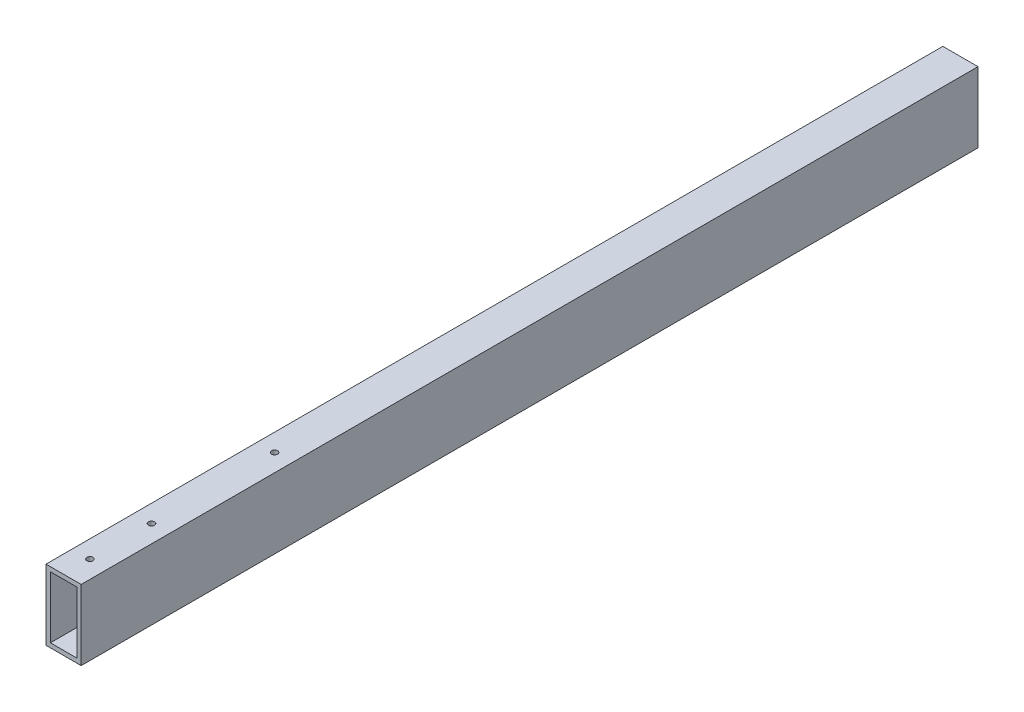
ISO-10303-21;
HEADER;
FILE_DESCRIPTION(('STEP AP214'),'2;1');
FILE_NAME('part.step','',(''),(''),'','','');
FILE_SCHEMA(('AUTOMOTIVE_DESIGN { 1 0 10303 214 1 1 1 1 }'));
ENDSEC;
DATA;
#1=APPLICATION_CONTEXT('core data for automotive mechanical design processes');
#2=APPLICATION_PROTOCOL_DEFINITION('international standard','automotive_design',2000,#1);
#3=PRODUCT_CONTEXT('',#1,'mechanical');
#4=PRODUCT('Part','Part','',(#3));
#5=PRODUCT_RELATED_PRODUCT_CATEGORY('part','',(#4));
#6=PRODUCT_DEFINITION_FORMATION('','',#4);
#7=PRODUCT_DEFINITION_CONTEXT('part definition',#1,'design');
#8=PRODUCT_DEFINITION('design','',#6,#7);
#9=PRODUCT_DEFINITION_SHAPE('','',#8);
#10=(LENGTH_UNIT() NAMED_UNIT(*) SI_UNIT(.MILLI.,.METRE.));
#11=(NAMED_UNIT(*) PLANE_ANGLE_UNIT() SI_UNIT($,.RADIAN.));
#12=(NAMED_UNIT(*) SI_UNIT($,.STERADIAN.) SOLID_ANGLE_UNIT());
#13=UNCERTAINTY_MEASURE_WITH_UNIT(LENGTH_MEASURE(1.E-05),#10,'distance_accuracy_value','');
#14=(GEOMETRIC_REPRESENTATION_CONTEXT(3) GLOBAL_UNCERTAINTY_ASSIGNED_CONTEXT((#13)) GLOBAL_UNIT_ASSIGNED_CONTEXT((#10,
#11,#12)) REPRESENTATION_CONTEXT('',''));
#15=CARTESIAN_POINT('',(0.,0.,0.));
#16=DIRECTION('',(0.,0.,1.));
#17=DIRECTION('',(1.,0.,0.));
#18=AXIS2_PLACEMENT_3D('',#15,#16,#17);
#19=CARTESIAN_POINT('',(0.,0.,323.85));
#20=DIRECTION('',(0.,0.,1.));
#21=DIRECTION('',(1.,0.,0.));
#22=AXIS2_PLACEMENT_3D('',#19,#20,#21);
#23=PLANE('',#22);
#24=DIRECTION('',(0.,1.,0.));
#25=VECTOR('',#24,1.);
#26=CARTESIAN_POINT('',(12.7,25.4,323.85));
#27=LINE('',#26,#25);
#28=CARTESIAN_POINT('',(12.7,-25.4,323.85));
#29=VERTEX_POINT('',#28);
#30=CARTESIAN_POINT('',(12.7,25.4,323.85));
#31=VERTEX_POINT('',#30);
#32=EDGE_CURVE('E140',#29,#31,#27,.T.);
#33=ORIENTED_EDGE('',*,*,#32,.T.);
#34=DIRECTION('',(-1.,0.,0.));
#35=VECTOR('',#34,1.);
#36=CARTESIAN_POINT('',(-12.7,25.4,323.85));
#37=LINE('',#36,#35);
#38=CARTESIAN_POINT('',(-12.7,25.4,323.85));
#39=VERTEX_POINT('',#38);
#40=EDGE_CURVE('E143',#31,#39,#37,.T.);
#41=ORIENTED_EDGE('',*,*,#40,.T.);
#42=DIRECTION('',(0.,-1.,0.));
#43=VECTOR('',#42,1.);
#44=CARTESIAN_POINT('',(-12.7,25.4,323.85));
#45=LINE('',#44,#43);
#46=CARTESIAN_POINT('',(-12.7,-25.4,323.85));
#47=VERTEX_POINT('',#46);
#48=EDGE_CURVE('E146',#39,#47,#45,.T.);
#49=ORIENTED_EDGE('',*,*,#48,.T.);
#50=DIRECTION('',(1.,0.,0.));
#51=VECTOR('',#50,1.);
#52=CARTESIAN_POINT('',(-12.7,-25.4,323.85));
#53=LINE('',#52,#51);
#54=EDGE_CURVE('E148',#47,#29,#53,.T.);
#55=ORIENTED_EDGE('',*,*,#54,.T.);
#56=EDGE_LOOP('',(#33,#41,#49,#55));
#57=FACE_BOUND('',#56,.T.);
#58=DIRECTION('',(1.,0.,0.));
#59=VECTOR('',#58,1.);
#60=CARTESIAN_POINT('',(-9.525,-22.225,323.85));
#61=LINE('',#60,#59);
#62=CARTESIAN_POINT('',(-9.525,-22.225,323.85));
#63=VERTEX_POINT('',#62);
#64=CARTESIAN_POINT('',(9.52500000000001,-22.225,323.85));
#65=VERTEX_POINT('',#64);
#66=EDGE_CURVE('E110',#63,#65,#61,.T.);
#67=ORIENTED_EDGE('',*,*,#66,.F.);
#68=DIRECTION('',(0.,-1.,0.));
#69=VECTOR('',#68,1.);
#70=CARTESIAN_POINT('',(-9.525,22.225,323.85));
#71=LINE('',#70,#69);
#72=CARTESIAN_POINT('',(-9.525,22.225,323.85));
#73=VERTEX_POINT('',#72);
#74=EDGE_CURVE('E102',#73,#63,#71,.T.);
#75=ORIENTED_EDGE('',*,*,#74,.F.);
#76=DIRECTION('',(-1.,0.,0.));
#77=VECTOR('',#76,1.);
#78=CARTESIAN_POINT('',(-9.525,22.225,323.85));
#79=LINE('',#78,#77);
#80=CARTESIAN_POINT('',(9.525,22.225,323.85));
#81=VERTEX_POINT('',#80);
#82=EDGE_CURVE('E124',#81,#73,#79,.T.);
#83=ORIENTED_EDGE('',*,*,#82,.F.);
#84=DIRECTION('',(0.,1.,0.));
#85=VECTOR('',#84,1.);
#86=CARTESIAN_POINT('',(9.525,22.225,323.85));
#87=LINE('',#86,#85);
#88=EDGE_CURVE('E122',#65,#81,#87,.T.);
#89=ORIENTED_EDGE('',*,*,#88,.F.);
#90=EDGE_LOOP('',(#67,#75,#83,#89));
#91=FACE_BOUND('',#90,.T.);
#92=ADVANCED_FACE('F35',(#57,#91),#23,.T.);
#93=CARTESIAN_POINT('',(0.,0.,-323.85));
#94=DIRECTION('',(0.,0.,1.));
#95=DIRECTION('',(1.,0.,0.));
#96=AXIS2_PLACEMENT_3D('',#93,#94,#95);
#97=PLANE('',#96);
#98=DIRECTION('',(0.,1.,0.));
#99=VECTOR('',#98,1.);
#100=CARTESIAN_POINT('',(12.7,25.4,-323.85));
#101=LINE('',#100,#99);
#102=CARTESIAN_POINT('',(12.7,-25.4,-323.85));
#103=VERTEX_POINT('',#102);
#104=CARTESIAN_POINT('',(12.7,25.4,-323.85));
#105=VERTEX_POINT('',#104);
#106=EDGE_CURVE('E118',#103,#105,#101,.T.);
#107=ORIENTED_EDGE('',*,*,#106,.F.);
#108=DIRECTION('',(1.,0.,0.));
#109=VECTOR('',#108,1.);
#110=CARTESIAN_POINT('',(-12.7,-25.4,-323.85));
#111=LINE('',#110,#109);
#112=CARTESIAN_POINT('',(-12.7,-25.4,-323.85));
#113=VERTEX_POINT('',#112);
#114=EDGE_CURVE('E144',#113,#103,#111,.T.);
#115=ORIENTED_EDGE('',*,*,#114,.F.);
#116=DIRECTION('',(0.,-1.,0.));
#117=VECTOR('',#116,1.);
#118=CARTESIAN_POINT('',(-12.7,25.4,-323.85));
#119=LINE('',#118,#117);
#120=CARTESIAN_POINT('',(-12.7,25.4,-323.85));
#121=VERTEX_POINT('',#120);
#122=EDGE_CURVE('E155',#121,#113,#119,.T.);
#123=ORIENTED_EDGE('',*,*,#122,.F.);
#124=DIRECTION('',(-1.,0.,0.));
#125=VECTOR('',#124,1.);
#126=CARTESIAN_POINT('',(-12.7,25.4,-323.85));
#127=LINE('',#126,#125);
#128=EDGE_CURVE('E153',#105,#121,#127,.T.);
#129=ORIENTED_EDGE('',*,*,#128,.F.);
#130=EDGE_LOOP('',(#107,#115,#123,#129));
#131=FACE_BOUND('',#130,.T.);
#132=DIRECTION('',(0.,-1.,0.));
#133=VECTOR('',#132,1.);
#134=CARTESIAN_POINT('',(-9.525,22.225,-323.85));
#135=LINE('',#134,#133);
#136=CARTESIAN_POINT('',(-9.525,22.225,-323.85));
#137=VERTEX_POINT('',#136);
#138=CARTESIAN_POINT('',(-9.525,-22.225,-323.85));
#139=VERTEX_POINT('',#138);
#140=EDGE_CURVE('E60',#137,#139,#135,.T.);
#141=ORIENTED_EDGE('',*,*,#140,.T.);
#142=DIRECTION('',(1.,0.,0.));
#143=VECTOR('',#142,1.);
#144=CARTESIAN_POINT('',(-9.525,-22.225,-323.85));
#145=LINE('',#144,#143);
#146=CARTESIAN_POINT('',(9.52500000000001,-22.225,-323.85));
#147=VERTEX_POINT('',#146);
#148=EDGE_CURVE('E117',#139,#147,#145,.T.);
#149=ORIENTED_EDGE('',*,*,#148,.T.);
#150=DIRECTION('',(0.,1.,0.));
#151=VECTOR('',#150,1.);
#152=CARTESIAN_POINT('',(9.525,22.225,-323.85));
#153=LINE('',#152,#151);
#154=CARTESIAN_POINT('',(9.525,22.225,-323.85));
#155=VERTEX_POINT('',#154);
#156=EDGE_CURVE('E132',#147,#155,#153,.T.);
#157=ORIENTED_EDGE('',*,*,#156,.T.);
#158=DIRECTION('',(-1.,0.,0.));
#159=VECTOR('',#158,1.);
#160=CARTESIAN_POINT('',(-9.525,22.225,-323.85));
#161=LINE('',#160,#159);
#162=EDGE_CURVE('E111',#155,#137,#161,.T.);
#163=ORIENTED_EDGE('',*,*,#162,.T.);
#164=EDGE_LOOP('',(#141,#149,#157,#163));
#165=FACE_BOUND('',#164,.T.);
#166=ADVANCED_FACE('F202',(#131,#165),#97,.F.);
#167=CARTESIAN_POINT('',(12.7,25.4,323.85));
#168=DIRECTION('',(-1.,0.,0.));
#169=DIRECTION('',(0.,-1.,0.));
#170=AXIS2_PLACEMENT_3D('',#167,#168,#169);
#171=PLANE('',#170);
#172=ORIENTED_EDGE('',*,*,#106,.T.);
#173=DIRECTION('',(0.,0.,-1.));
#174=VECTOR('',#173,1.);
#175=CARTESIAN_POINT('',(12.7,25.4,323.85));
#176=LINE('',#175,#174);
#177=EDGE_CURVE('E11',#31,#105,#176,.T.);
#178=ORIENTED_EDGE('',*,*,#177,.F.);
#179=ORIENTED_EDGE('',*,*,#32,.F.);
#180=DIRECTION('',(0.,0.,-1.));
#181=VECTOR('',#180,1.);
#182=CARTESIAN_POINT('',(12.7,-25.4,323.85));
#183=LINE('',#182,#181);
#184=EDGE_CURVE('E150',#29,#103,#183,.T.);
#185=ORIENTED_EDGE('',*,*,#184,.T.);
#186=EDGE_LOOP('',(#172,#178,#179,#185));
#187=FACE_BOUND('',#186,.T.);
#188=ADVANCED_FACE('F37',(#187),#171,.F.);
#189=CARTESIAN_POINT('',(-12.7,25.4,323.85));
#190=DIRECTION('',(0.,-1.,0.));
#191=DIRECTION('',(0.,0.,-1.));
#192=AXIS2_PLACEMENT_3D('',#189,#190,#191);
#193=PLANE('',#192);
#194=CARTESIAN_POINT('',(8.24644684760401E-05,25.4,304.800000000002));
#195=DIRECTION('',(0.,1.,0.));
#196=DIRECTION('',(0.,0.,1.));
#197=AXIS2_PLACEMENT_3D('',#194,#195,#196);
#198=CIRCLE('',#197,2.19709999999998);
#199=CARTESIAN_POINT('',(8.24644684760401E-05,25.4,306.997100000002));
#200=VERTEX_POINT('',#199);
#201=EDGE_CURVE('E240',#200,#200,#198,.T.);
#202=ORIENTED_EDGE('',*,*,#201,.F.);
#203=EDGE_LOOP('',(#202));
#204=FACE_BOUND('',#203,.T.);
#205=CARTESIAN_POINT('',(8.24644693017684E-05,25.4,260.350000000002));
#206=DIRECTION('',(0.,1.,0.));
#207=DIRECTION('',(0.,0.,1.));
#208=AXIS2_PLACEMENT_3D('',#205,#206,#207);
#209=CIRCLE('',#208,2.19709999999998);
#210=CARTESIAN_POINT('',(8.24644693017684E-05,25.4,262.547100000002));
#211=VERTEX_POINT('',#210);
#212=EDGE_CURVE('E244',#211,#211,#209,.T.);
#213=ORIENTED_EDGE('',*,*,#212,.F.);
#214=EDGE_LOOP('',(#213));
#215=FACE_BOUND('',#214,.T.);
#216=CARTESIAN_POINT('',(8.24644696278964E-05,25.4,171.450000000002));
#217=DIRECTION('',(0.,1.,0.));
#218=DIRECTION('',(0.,0.,1.));
#219=AXIS2_PLACEMENT_3D('',#216,#217,#218);
#220=CIRCLE('',#219,2.19709999999998);
#221=CARTESIAN_POINT('',(8.24644696278964E-05,25.4,173.647100000002));
#222=VERTEX_POINT('',#221);
#223=EDGE_CURVE('E248',#222,#222,#220,.T.);
#224=ORIENTED_EDGE('',*,*,#223,.F.);
#225=EDGE_LOOP('',(#224));
#226=FACE_BOUND('',#225,.T.);
#227=ORIENTED_EDGE('',*,*,#128,.T.);
#228=DIRECTION('',(0.,0.,-1.));
#229=VECTOR('',#228,1.);
#230=CARTESIAN_POINT('',(-12.7,25.4,323.85));
#231=LINE('',#230,#229);
#232=EDGE_CURVE('E44',#39,#121,#231,.T.);
#233=ORIENTED_EDGE('',*,*,#232,.F.);
#234=ORIENTED_EDGE('',*,*,#40,.F.);
#235=ORIENTED_EDGE('',*,*,#177,.T.);
#236=EDGE_LOOP('',(#227,#233,#234,#235));
#237=FACE_BOUND('',#236,.T.);
#238=ADVANCED_FACE('F229',(#204,#215,#226,#237),#193,.F.);
#239=CARTESIAN_POINT('',(-12.7,25.4,323.85));
#240=DIRECTION('',(1.,0.,0.));
#241=DIRECTION('',(0.,1.,0.));
#242=AXIS2_PLACEMENT_3D('',#239,#240,#241);
#243=PLANE('',#242);
#244=ORIENTED_EDGE('',*,*,#122,.T.);
#245=DIRECTION('',(0.,0.,-1.));
#246=VECTOR('',#245,1.);
#247=CARTESIAN_POINT('',(-12.7,-25.4,323.85));
#248=LINE('',#247,#246);
#249=EDGE_CURVE('E160',#47,#113,#248,.T.);
#250=ORIENTED_EDGE('',*,*,#249,.F.);
#251=ORIENTED_EDGE('',*,*,#48,.F.);
#252=ORIENTED_EDGE('',*,*,#232,.T.);
#253=EDGE_LOOP('',(#244,#250,#251,#252));
#254=FACE_BOUND('',#253,.T.);
#255=ADVANCED_FACE('F226',(#254),#243,.F.);
#256=CARTESIAN_POINT('',(-12.7,-25.4,323.85));
#257=DIRECTION('',(0.,1.,0.));
#258=DIRECTION('',(0.,0.,1.));
#259=AXIS2_PLACEMENT_3D('',#256,#257,#258);
#260=PLANE('',#259);
#261=CARTESIAN_POINT('',(8.24644684760401E-05,-25.4,304.800000000002));
#262=DIRECTION('',(0.,1.,0.));
#263=DIRECTION('',(0.,0.,1.));
#264=AXIS2_PLACEMENT_3D('',#261,#262,#263);
#265=CIRCLE('',#264,2.19709999999998);
#266=CARTESIAN_POINT('',(8.24644684760401E-05,-25.4,306.997100000002));
#267=VERTEX_POINT('',#266);
#268=EDGE_CURVE('E168',#267,#267,#265,.F.);
#269=ORIENTED_EDGE('',*,*,#268,.F.);
#270=EDGE_LOOP('',(#269));
#271=FACE_BOUND('',#270,.T.);
#272=CARTESIAN_POINT('',(8.24644693017684E-05,-25.4,260.350000000002));
#273=DIRECTION('',(0.,1.,0.));
#274=DIRECTION('',(0.,0.,1.));
#275=AXIS2_PLACEMENT_3D('',#272,#273,#274);
#276=CIRCLE('',#275,2.19709999999998);
#277=CARTESIAN_POINT('',(8.24644693017684E-05,-25.4,262.547100000002));
#278=VERTEX_POINT('',#277);
#279=EDGE_CURVE('E263',#278,#278,#276,.F.);
#280=ORIENTED_EDGE('',*,*,#279,.F.);
#281=EDGE_LOOP('',(#280));
#282=FACE_BOUND('',#281,.T.);
#283=CARTESIAN_POINT('',(8.24644696278964E-05,-25.4,171.450000000002));
#284=DIRECTION('',(0.,1.,0.));
#285=DIRECTION('',(0.,0.,1.));
#286=AXIS2_PLACEMENT_3D('',#283,#284,#285);
#287=CIRCLE('',#286,2.19709999999998);
#288=CARTESIAN_POINT('',(8.24644696278964E-05,-25.4,173.647100000002));
#289=VERTEX_POINT('',#288);
#290=EDGE_CURVE('E181',#289,#289,#287,.F.);
#291=ORIENTED_EDGE('',*,*,#290,.F.);
#292=EDGE_LOOP('',(#291));
#293=FACE_BOUND('',#292,.T.);
#294=ORIENTED_EDGE('',*,*,#114,.T.);
#295=ORIENTED_EDGE('',*,*,#184,.F.);
#296=ORIENTED_EDGE('',*,*,#54,.F.);
#297=ORIENTED_EDGE('',*,*,#249,.T.);
#298=EDGE_LOOP('',(#294,#295,#296,#297));
#299=FACE_BOUND('',#298,.T.);
#300=ADVANCED_FACE('F223',(#271,#282,#293,#299),#260,.F.);
#301=CARTESIAN_POINT('',(-9.525,22.225,323.85));
#302=DIRECTION('',(1.,0.,0.));
#303=DIRECTION('',(0.,1.,0.));
#304=AXIS2_PLACEMENT_3D('',#301,#302,#303);
#305=PLANE('',#304);
#306=ORIENTED_EDGE('',*,*,#140,.F.);
#307=DIRECTION('',(0.,0.,-1.));
#308=VECTOR('',#307,1.);
#309=CARTESIAN_POINT('',(-9.525,22.225,323.85));
#310=LINE('',#309,#308);
#311=EDGE_CURVE('E106',#73,#137,#310,.T.);
#312=ORIENTED_EDGE('',*,*,#311,.F.);
#313=ORIENTED_EDGE('',*,*,#74,.T.);
#314=DIRECTION('',(0.,0.,-1.));
#315=VECTOR('',#314,1.);
#316=CARTESIAN_POINT('',(-9.525,-22.225,323.85));
#317=LINE('',#316,#315);
#318=EDGE_CURVE('E105',#63,#139,#317,.T.);
#319=ORIENTED_EDGE('',*,*,#318,.T.);
#320=EDGE_LOOP('',(#306,#312,#313,#319));
#321=FACE_BOUND('',#320,.T.);
#322=ADVANCED_FACE('F104',(#321),#305,.T.);
#323=CARTESIAN_POINT('',(-9.525,-22.225,323.85));
#324=DIRECTION('',(0.,1.,0.));
#325=DIRECTION('',(-1.,0.,0.));
#326=AXIS2_PLACEMENT_3D('',#323,#324,#325);
#327=PLANE('',#326);
#328=CARTESIAN_POINT('',(8.24644684760401E-05,-22.225,304.800000000002));
#329=DIRECTION('',(0.,1.,0.));
#330=DIRECTION('',(-1.,0.,0.));
#331=AXIS2_PLACEMENT_3D('',#328,#329,#330);
#332=CIRCLE('',#331,2.19709999999998);
#333=CARTESIAN_POINT('',(-2.19701753553151,-22.225,304.800000000002));
#334=VERTEX_POINT('',#333);
#335=EDGE_CURVE('E130',#334,#334,#332,.T.);
#336=ORIENTED_EDGE('',*,*,#335,.F.);
#337=EDGE_LOOP('',(#336));
#338=FACE_BOUND('',#337,.T.);
#339=CARTESIAN_POINT('',(8.24644693017684E-05,-22.225,260.350000000002));
#340=DIRECTION('',(0.,1.,0.));
#341=DIRECTION('',(-1.,0.,0.));
#342=AXIS2_PLACEMENT_3D('',#339,#340,#341);
#343=CIRCLE('',#342,2.19709999999998);
#344=CARTESIAN_POINT('',(-2.19701753553068,-22.225,260.350000000002));
#345=VERTEX_POINT('',#344);
#346=EDGE_CURVE('E171',#345,#345,#343,.T.);
#347=ORIENTED_EDGE('',*,*,#346,.F.);
#348=EDGE_LOOP('',(#347));
#349=FACE_BOUND('',#348,.T.);
#350=CARTESIAN_POINT('',(8.24644696278964E-05,-22.225,171.450000000002));
#351=DIRECTION('',(0.,1.,0.));
#352=DIRECTION('',(-1.,0.,0.));
#353=AXIS2_PLACEMENT_3D('',#350,#351,#352);
#354=CIRCLE('',#353,2.19709999999998);
#355=CARTESIAN_POINT('',(-2.19701753553035,-22.225,171.450000000002));
#356=VERTEX_POINT('',#355);
#357=EDGE_CURVE('E167',#356,#356,#354,.T.);
#358=ORIENTED_EDGE('',*,*,#357,.F.);
#359=EDGE_LOOP('',(#358));
#360=FACE_BOUND('',#359,.T.);
#361=ORIENTED_EDGE('',*,*,#148,.F.);
#362=ORIENTED_EDGE('',*,*,#318,.F.);
#363=ORIENTED_EDGE('',*,*,#66,.T.);
#364=DIRECTION('',(0.,0.,-1.));
#365=VECTOR('',#364,1.);
#366=CARTESIAN_POINT('',(9.52500000000001,-22.225,323.85));
#367=LINE('',#366,#365);
#368=EDGE_CURVE('E119',#65,#147,#367,.T.);
#369=ORIENTED_EDGE('',*,*,#368,.T.);
#370=EDGE_LOOP('',(#361,#362,#363,#369));
#371=FACE_BOUND('',#370,.T.);
#372=ADVANCED_FACE('F114',(#338,#349,#360,#371),#327,.T.);
#373=CARTESIAN_POINT('',(9.525,22.225,323.85));
#374=DIRECTION('',(-1.,0.,0.));
#375=DIRECTION('',(0.,-1.,0.));
#376=AXIS2_PLACEMENT_3D('',#373,#374,#375);
#377=PLANE('',#376);
#378=ORIENTED_EDGE('',*,*,#156,.F.);
#379=ORIENTED_EDGE('',*,*,#368,.F.);
#380=ORIENTED_EDGE('',*,*,#88,.T.);
#381=DIRECTION('',(0.,0.,-1.));
#382=VECTOR('',#381,1.);
#383=CARTESIAN_POINT('',(9.525,22.225,323.85));
#384=LINE('',#383,#382);
#385=EDGE_CURVE('E52',#81,#155,#384,.T.);
#386=ORIENTED_EDGE('',*,*,#385,.T.);
#387=EDGE_LOOP('',(#378,#379,#380,#386));
#388=FACE_BOUND('',#387,.T.);
#389=ADVANCED_FACE('F196',(#388),#377,.T.);
#390=CARTESIAN_POINT('',(-9.525,22.225,323.85));
#391=DIRECTION('',(0.,-1.,0.));
#392=DIRECTION('',(0.,0.,-1.));
#393=AXIS2_PLACEMENT_3D('',#390,#391,#392);
#394=PLANE('',#393);
#395=CARTESIAN_POINT('',(8.24644684760401E-05,22.225,304.800000000002));
#396=DIRECTION('',(0.,-1.,0.));
#397=DIRECTION('',(0.,0.,-1.));
#398=AXIS2_PLACEMENT_3D('',#395,#396,#397);
#399=CIRCLE('',#398,2.19709999999998);
#400=CARTESIAN_POINT('',(8.24644684760401E-05,22.225,302.602900000002));
#401=VERTEX_POINT('',#400);
#402=EDGE_CURVE('E39',#401,#401,#399,.T.);
#403=ORIENTED_EDGE('',*,*,#402,.F.);
#404=EDGE_LOOP('',(#403));
#405=FACE_BOUND('',#404,.T.);
#406=CARTESIAN_POINT('',(8.24644693017684E-05,22.225,260.350000000002));
#407=DIRECTION('',(0.,-1.,0.));
#408=DIRECTION('',(0.,0.,-1.));
#409=AXIS2_PLACEMENT_3D('',#406,#407,#408);
#410=CIRCLE('',#409,2.19709999999998);
#411=CARTESIAN_POINT('',(8.24644693017684E-05,22.225,258.152900000002));
#412=VERTEX_POINT('',#411);
#413=EDGE_CURVE('E169',#412,#412,#410,.T.);
#414=ORIENTED_EDGE('',*,*,#413,.F.);
#415=EDGE_LOOP('',(#414));
#416=FACE_BOUND('',#415,.T.);
#417=CARTESIAN_POINT('',(8.24644696278964E-05,22.225,171.450000000002));
#418=DIRECTION('',(0.,-1.,0.));
#419=DIRECTION('',(0.,0.,-1.));
#420=AXIS2_PLACEMENT_3D('',#417,#418,#419);
#421=CIRCLE('',#420,2.19709999999998);
#422=CARTESIAN_POINT('',(8.24644696278964E-05,22.225,169.252900000002));
#423=VERTEX_POINT('',#422);
#424=EDGE_CURVE('E165',#423,#423,#421,.T.);
#425=ORIENTED_EDGE('',*,*,#424,.F.);
#426=EDGE_LOOP('',(#425));
#427=FACE_BOUND('',#426,.T.);
#428=ORIENTED_EDGE('',*,*,#162,.F.);
#429=ORIENTED_EDGE('',*,*,#385,.F.);
#430=ORIENTED_EDGE('',*,*,#82,.T.);
#431=ORIENTED_EDGE('',*,*,#311,.T.);
#432=EDGE_LOOP('',(#428,#429,#430,#431));
#433=FACE_BOUND('',#432,.T.);
#434=ADVANCED_FACE('F192',(#405,#416,#427,#433),#394,.T.);
#435=CARTESIAN_POINT('',(8.24644696278964E-05,-31.6143372357798,171.450000000002));
#436=DIRECTION('',(0.,1.,0.));
#437=DIRECTION('',(0.,0.,1.));
#438=AXIS2_PLACEMENT_3D('',#435,#436,#437);
#439=CYLINDRICAL_SURFACE('',#438,2.19709999999998);
#440=ORIENTED_EDGE('',*,*,#424,.T.);
#441=EDGE_LOOP('',(#440));
#442=FACE_BOUND('',#441,.T.);
#443=ORIENTED_EDGE('',*,*,#223,.T.);
#444=EDGE_LOOP('',(#443));
#445=FACE_BOUND('',#444,.T.);
#446=ADVANCED_FACE('F195',(#442,#445),#439,.F.);
#447=CARTESIAN_POINT('',(8.24644693017684E-05,-31.6143372357798,260.350000000002));
#448=DIRECTION('',(0.,1.,0.));
#449=DIRECTION('',(0.,0.,1.));
#450=AXIS2_PLACEMENT_3D('',#447,#448,#449);
#451=CYLINDRICAL_SURFACE('',#450,2.19709999999998);
#452=ORIENTED_EDGE('',*,*,#413,.T.);
#453=EDGE_LOOP('',(#452));
#454=FACE_BOUND('',#453,.T.);
#455=ORIENTED_EDGE('',*,*,#212,.T.);
#456=EDGE_LOOP('',(#455));
#457=FACE_BOUND('',#456,.T.);
#458=ADVANCED_FACE('F271',(#454,#457),#451,.F.);
#459=CARTESIAN_POINT('',(8.24644684760401E-05,-31.6143372357798,304.800000000002));
#460=DIRECTION('',(0.,1.,0.));
#461=DIRECTION('',(0.,0.,1.));
#462=AXIS2_PLACEMENT_3D('',#459,#460,#461);
#463=CYLINDRICAL_SURFACE('',#462,2.19709999999998);
#464=ORIENTED_EDGE('',*,*,#402,.T.);
#465=EDGE_LOOP('',(#464));
#466=FACE_BOUND('',#465,.T.);
#467=ORIENTED_EDGE('',*,*,#201,.T.);
#468=EDGE_LOOP('',(#467));
#469=FACE_BOUND('',#468,.T.);
#470=ADVANCED_FACE('F189',(#466,#469),#463,.F.);
#471=ORIENTED_EDGE('',*,*,#357,.T.);
#472=EDGE_LOOP('',(#471));
#473=FACE_BOUND('',#472,.T.);
#474=ORIENTED_EDGE('',*,*,#290,.T.);
#475=EDGE_LOOP('',(#474));
#476=FACE_BOUND('',#475,.T.);
#477=ADVANCED_FACE('F270',(#473,#476),#439,.F.);
#478=ORIENTED_EDGE('',*,*,#346,.T.);
#479=EDGE_LOOP('',(#478));
#480=FACE_BOUND('',#479,.T.);
#481=ORIENTED_EDGE('',*,*,#279,.T.);
#482=EDGE_LOOP('',(#481));
#483=FACE_BOUND('',#482,.T.);
#484=ADVANCED_FACE('F278',(#480,#483),#451,.F.);
#485=ORIENTED_EDGE('',*,*,#335,.T.);
#486=EDGE_LOOP('',(#485));
#487=FACE_BOUND('',#486,.T.);
#488=ORIENTED_EDGE('',*,*,#268,.T.);
#489=EDGE_LOOP('',(#488));
#490=FACE_BOUND('',#489,.T.);
#491=ADVANCED_FACE('F273',(#487,#490),#463,.F.);
#492=CLOSED_SHELL('',(#92,#166,#188,#238,#255,#300,#322,#372,#389,#434,#446,#458,#470,#477,#484,#491));
#493=MANIFOLD_SOLID_BREP('B2',#492);
#494=ADVANCED_BREP_SHAPE_REPRESENTATION('',(#18,#493),#14);
#495=SHAPE_DEFINITION_REPRESENTATION(#9,#494);
ENDSEC;
END-ISO-10303-21;
